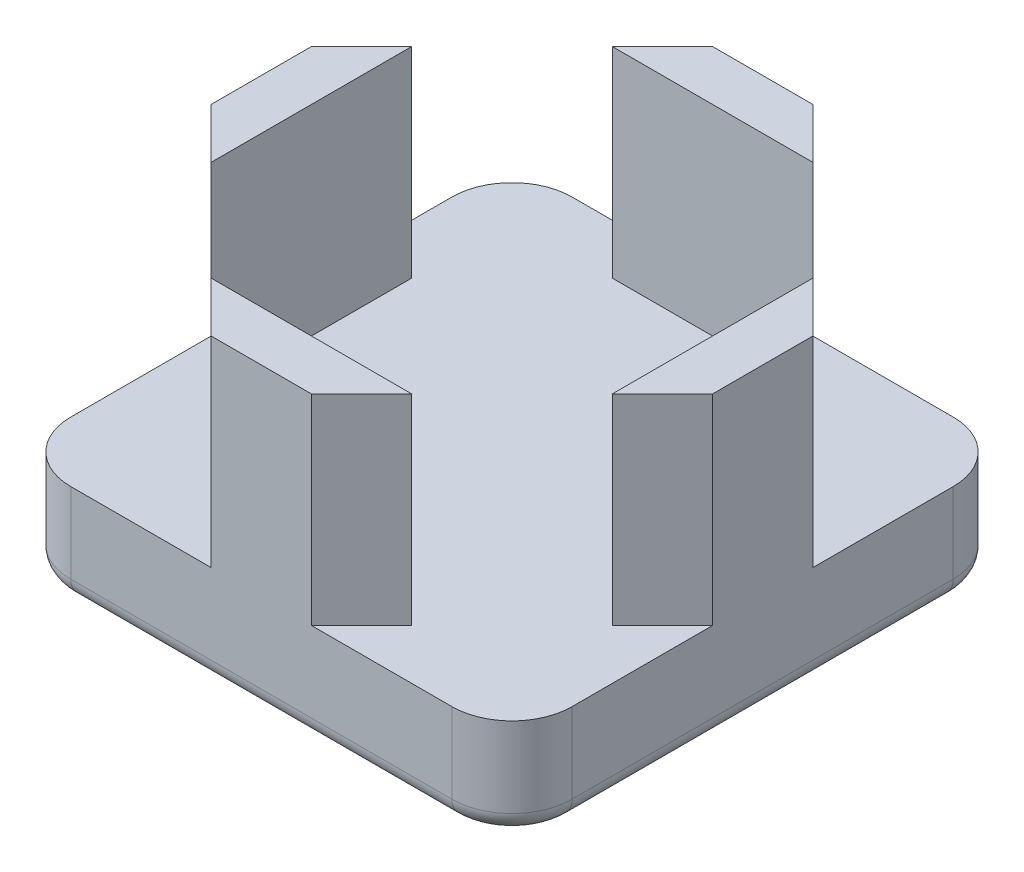
ISO-10303-21;
HEADER;
FILE_DESCRIPTION(('STEP AP214'),'2;1');
FILE_NAME('part.step','',(''),(''),'','','');
FILE_SCHEMA(('AUTOMOTIVE_DESIGN { 1 0 10303 214 1 1 1 1 }'));
ENDSEC;
DATA;
#1=APPLICATION_CONTEXT('core data for automotive mechanical design processes');
#2=APPLICATION_PROTOCOL_DEFINITION('international standard','automotive_design',2000,#1);
#3=PRODUCT_CONTEXT('',#1,'mechanical');
#4=PRODUCT('Part','Part','',(#3));
#5=PRODUCT_RELATED_PRODUCT_CATEGORY('part','',(#4));
#6=PRODUCT_DEFINITION_FORMATION('','',#4);
#7=PRODUCT_DEFINITION_CONTEXT('part definition',#1,'design');
#8=PRODUCT_DEFINITION('design','',#6,#7);
#9=PRODUCT_DEFINITION_SHAPE('','',#8);
#10=(LENGTH_UNIT() NAMED_UNIT(*) SI_UNIT(.MILLI.,.METRE.));
#11=(NAMED_UNIT(*) PLANE_ANGLE_UNIT() SI_UNIT($,.RADIAN.));
#12=(NAMED_UNIT(*) SI_UNIT($,.STERADIAN.) SOLID_ANGLE_UNIT());
#13=UNCERTAINTY_MEASURE_WITH_UNIT(LENGTH_MEASURE(1.E-05),#10,'distance_accuracy_value','');
#14=(GEOMETRIC_REPRESENTATION_CONTEXT(3) GLOBAL_UNCERTAINTY_ASSIGNED_CONTEXT((#13)) GLOBAL_UNIT_ASSIGNED_CONTEXT((#10,
#11,#12)) REPRESENTATION_CONTEXT('',''));
#15=CARTESIAN_POINT('',(0.,0.,0.));
#16=DIRECTION('',(0.,0.,1.));
#17=DIRECTION('',(1.,0.,0.));
#18=AXIS2_PLACEMENT_3D('',#15,#16,#17);
#19=CARTESIAN_POINT('',(0.,0.,0.));
#20=DIRECTION('',(0.,1.,0.));
#21=DIRECTION('',(0.,0.,1.));
#22=AXIS2_PLACEMENT_3D('',#19,#20,#21);
#23=PLANE('',#22);
#24=DIRECTION('',(-0.707106781186551,0.,0.707106781186545));
#25=VECTOR('',#24,1.);
#26=CARTESIAN_POINT('',(7.49999999999999,0.,7.50000000000005));
#27=LINE('',#26,#25);
#28=CARTESIAN_POINT('',(5.00000000000002,0.,10.));
#29=VERTEX_POINT('',#28);
#30=CARTESIAN_POINT('',(2.5,0.,12.5));
#31=VERTEX_POINT('',#30);
#32=EDGE_CURVE('E224',#29,#31,#27,.T.);
#33=ORIENTED_EDGE('',*,*,#32,.T.);
#34=DIRECTION('',(-1.,0.,0.));
#35=VECTOR('',#34,1.);
#36=CARTESIAN_POINT('',(0.,0.,12.5));
#37=LINE('',#36,#35);
#38=CARTESIAN_POINT('',(9.5,0.,12.5));
#39=VERTEX_POINT('',#38);
#40=EDGE_CURVE('E320',#39,#31,#37,.T.);
#41=ORIENTED_EDGE('',*,*,#40,.F.);
#42=CARTESIAN_POINT('',(9.5,0.,9.49999999999999));
#43=DIRECTION('',(0.,1.,0.));
#44=DIRECTION('',(0.,0.,1.));
#45=AXIS2_PLACEMENT_3D('',#42,#43,#44);
#46=CIRCLE('',#45,3.);
#47=CARTESIAN_POINT('',(12.5,0.,9.49999999999999));
#48=VERTEX_POINT('',#47);
#49=EDGE_CURVE('E323',#48,#39,#46,.F.);
#50=ORIENTED_EDGE('',*,*,#49,.F.);
#51=DIRECTION('',(0.,0.,1.));
#52=VECTOR('',#51,1.);
#53=CARTESIAN_POINT('',(12.5,0.,0.));
#54=LINE('',#53,#52);
#55=CARTESIAN_POINT('',(12.5,0.,2.5));
#56=VERTEX_POINT('',#55);
#57=EDGE_CURVE('E326',#56,#48,#54,.T.);
#58=ORIENTED_EDGE('',*,*,#57,.F.);
#59=DIRECTION('',(0.707106781186551,0.,-0.707106781186544));
#60=VECTOR('',#59,1.);
#61=CARTESIAN_POINT('',(7.49999999999994,0.,7.50000000000001));
#62=LINE('',#61,#60);
#63=CARTESIAN_POINT('',(10.,0.,4.99999999999998));
#64=VERTEX_POINT('',#63);
#65=EDGE_CURVE('E273',#64,#56,#62,.T.);
#66=ORIENTED_EDGE('',*,*,#65,.F.);
#67=DIRECTION('',(0.,0.,1.));
#68=VECTOR('',#67,1.);
#69=CARTESIAN_POINT('',(10.,0.,0.));
#70=LINE('',#69,#68);
#71=CARTESIAN_POINT('',(10.,0.,-5.00000000000005));
#72=VERTEX_POINT('',#71);
#73=EDGE_CURVE('E229',#72,#64,#70,.T.);
#74=ORIENTED_EDGE('',*,*,#73,.F.);
#75=DIRECTION('',(-0.707106781186537,0.,-0.707106781186558));
#76=VECTOR('',#75,1.);
#77=CARTESIAN_POINT('',(7.50000000000018,0.,-7.49999999999996));
#78=LINE('',#77,#76);
#79=CARTESIAN_POINT('',(12.5,0.,-2.5));
#80=VERTEX_POINT('',#79);
#81=EDGE_CURVE('E263',#80,#72,#78,.T.);
#82=ORIENTED_EDGE('',*,*,#81,.F.);
#83=CARTESIAN_POINT('',(12.5,0.,-9.5));
#84=VERTEX_POINT('',#83);
#85=EDGE_CURVE('E327',#84,#80,#54,.T.);
#86=ORIENTED_EDGE('',*,*,#85,.F.);
#87=CARTESIAN_POINT('',(9.5,0.,-9.5));
#88=DIRECTION('',(0.,1.,0.));
#89=DIRECTION('',(0.,0.,1.));
#90=AXIS2_PLACEMENT_3D('',#87,#88,#89);
#91=CIRCLE('',#90,3.);
#92=CARTESIAN_POINT('',(9.49999999999999,0.,-12.5));
#93=VERTEX_POINT('',#92);
#94=EDGE_CURVE('E330',#93,#84,#91,.F.);
#95=ORIENTED_EDGE('',*,*,#94,.F.);
#96=DIRECTION('',(1.,0.,0.));
#97=VECTOR('',#96,1.);
#98=CARTESIAN_POINT('',(0.,0.,-12.5));
#99=LINE('',#98,#97);
#100=CARTESIAN_POINT('',(2.5,0.,-12.5));
#101=VERTEX_POINT('',#100);
#102=EDGE_CURVE('E333',#101,#93,#99,.T.);
#103=ORIENTED_EDGE('',*,*,#102,.F.);
#104=DIRECTION('',(-0.707106781186545,0.,-0.70710678118655));
#105=VECTOR('',#104,1.);
#106=CARTESIAN_POINT('',(7.50000000000001,0.,-7.49999999999995));
#107=LINE('',#106,#105);
#108=CARTESIAN_POINT('',(4.99999999999998,0.,-10.));
#109=VERTEX_POINT('',#108);
#110=EDGE_CURVE('E300',#109,#101,#107,.T.);
#111=ORIENTED_EDGE('',*,*,#110,.F.);
#112=DIRECTION('',(1.,0.,0.));
#113=VECTOR('',#112,1.);
#114=CARTESIAN_POINT('',(0.,0.,-10.));
#115=LINE('',#114,#113);
#116=CARTESIAN_POINT('',(-5.00000000000002,0.,-10.));
#117=VERTEX_POINT('',#116);
#118=EDGE_CURVE('E285',#117,#109,#115,.T.);
#119=ORIENTED_EDGE('',*,*,#118,.F.);
#120=DIRECTION('',(-0.707106781186551,0.,0.707106781186544));
#121=VECTOR('',#120,1.);
#122=CARTESIAN_POINT('',(-7.49999999999999,0.,-7.50000000000007));
#123=LINE('',#122,#121);
#124=CARTESIAN_POINT('',(-2.5,0.,-12.5));
#125=VERTEX_POINT('',#124);
#126=EDGE_CURVE('E290',#125,#117,#123,.T.);
#127=ORIENTED_EDGE('',*,*,#126,.F.);
#128=CARTESIAN_POINT('',(-9.5,0.,-12.5));
#129=VERTEX_POINT('',#128);
#130=EDGE_CURVE('E334',#129,#125,#99,.T.);
#131=ORIENTED_EDGE('',*,*,#130,.F.);
#132=CARTESIAN_POINT('',(-9.5,0.,-9.5));
#133=DIRECTION('',(0.,1.,0.));
#134=DIRECTION('',(0.,0.,1.));
#135=AXIS2_PLACEMENT_3D('',#132,#133,#134);
#136=CIRCLE('',#135,3.);
#137=CARTESIAN_POINT('',(-12.5,0.,-9.5));
#138=VERTEX_POINT('',#137);
#139=EDGE_CURVE('E337',#129,#138,#136,.T.);
#140=ORIENTED_EDGE('',*,*,#139,.T.);
#141=DIRECTION('',(0.,0.,-1.));
#142=VECTOR('',#141,1.);
#143=CARTESIAN_POINT('',(-12.5,0.,0.));
#144=LINE('',#143,#142);
#145=CARTESIAN_POINT('',(-12.5,0.,-2.5));
#146=VERTEX_POINT('',#145);
#147=EDGE_CURVE('E312',#146,#138,#144,.T.);
#148=ORIENTED_EDGE('',*,*,#147,.F.);
#149=DIRECTION('',(-0.707106781186551,0.,0.707106781186544));
#150=VECTOR('',#149,1.);
#151=CARTESIAN_POINT('',(-7.49999999999994,0.,-7.50000000000001));
#152=LINE('',#151,#150);
#153=CARTESIAN_POINT('',(-10.,0.,-4.99999999999998));
#154=VERTEX_POINT('',#153);
#155=EDGE_CURVE('E371',#154,#146,#152,.T.);
#156=ORIENTED_EDGE('',*,*,#155,.F.);
#157=DIRECTION('',(0.,0.,-1.));
#158=VECTOR('',#157,1.);
#159=CARTESIAN_POINT('',(-10.,0.,0.));
#160=LINE('',#159,#158);
#161=CARTESIAN_POINT('',(-10.,0.,5.00000000000002));
#162=VERTEX_POINT('',#161);
#163=EDGE_CURVE('E343',#162,#154,#160,.T.);
#164=ORIENTED_EDGE('',*,*,#163,.F.);
#165=DIRECTION('',(0.707106781186545,0.,0.70710678118655));
#166=VECTOR('',#165,1.);
#167=CARTESIAN_POINT('',(-7.50000000000005,0.,7.49999999999999));
#168=LINE('',#167,#166);
#169=CARTESIAN_POINT('',(-12.5,0.,2.5));
#170=VERTEX_POINT('',#169);
#171=EDGE_CURVE('E361',#170,#162,#168,.T.);
#172=ORIENTED_EDGE('',*,*,#171,.F.);
#173=CARTESIAN_POINT('',(-12.5,0.,9.5));
#174=VERTEX_POINT('',#173);
#175=EDGE_CURVE('E313',#174,#170,#144,.T.);
#176=ORIENTED_EDGE('',*,*,#175,.F.);
#177=CARTESIAN_POINT('',(-9.5,0.,9.5));
#178=DIRECTION('',(0.,1.,0.));
#179=DIRECTION('',(0.,0.,1.));
#180=AXIS2_PLACEMENT_3D('',#177,#178,#179);
#181=CIRCLE('',#180,3.);
#182=CARTESIAN_POINT('',(-9.5,0.,12.5));
#183=VERTEX_POINT('',#182);
#184=EDGE_CURVE('E316',#183,#174,#181,.F.);
#185=ORIENTED_EDGE('',*,*,#184,.F.);
#186=CARTESIAN_POINT('',(-2.5,0.,12.5));
#187=VERTEX_POINT('',#186);
#188=EDGE_CURVE('E319',#187,#183,#37,.T.);
#189=ORIENTED_EDGE('',*,*,#188,.F.);
#190=DIRECTION('',(-0.707106781186544,0.,-0.707106781186551));
#191=VECTOR('',#190,1.);
#192=CARTESIAN_POINT('',(-7.50000000000001,0.,7.49999999999994));
#193=LINE('',#192,#191);
#194=CARTESIAN_POINT('',(-4.99999999999998,0.,10.));
#195=VERTEX_POINT('',#194);
#196=EDGE_CURVE('E240',#187,#195,#193,.T.);
#197=ORIENTED_EDGE('',*,*,#196,.T.);
#198=DIRECTION('',(1.,0.,0.));
#199=VECTOR('',#198,1.);
#200=CARTESIAN_POINT('',(0.,0.,10.));
#201=LINE('',#200,#199);
#202=EDGE_CURVE('E250',#195,#29,#201,.T.);
#203=ORIENTED_EDGE('',*,*,#202,.T.);
#204=EDGE_LOOP('',(#33,#41,#50,#58,#66,#74,#82,#86,#95,#103,#111,#119,#127,#131,#140,#148,#156,
#164,#172,#176,#185,#189,#197,#203));
#205=FACE_BOUND('',#204,.T.);
#206=ADVANCED_FACE('F32',(#205),#23,.T.);
#207=CARTESIAN_POINT('',(-10.,10.,0.));
#208=DIRECTION('',(-1.,0.,0.));
#209=DIRECTION('',(0.,0.,1.));
#210=AXIS2_PLACEMENT_3D('',#207,#208,#209);
#211=PLANE('',#210);
#212=ORIENTED_EDGE('',*,*,#163,.T.);
#213=DIRECTION('',(0.,-1.,0.));
#214=VECTOR('',#213,1.);
#215=CARTESIAN_POINT('',(-10.,10.,-4.99999999999998));
#216=LINE('',#215,#214);
#217=CARTESIAN_POINT('',(-10.,10.,-4.99999999999998));
#218=VERTEX_POINT('',#217);
#219=EDGE_CURVE('E384',#218,#154,#216,.T.);
#220=ORIENTED_EDGE('',*,*,#219,.F.);
#221=DIRECTION('',(0.,0.,-1.));
#222=VECTOR('',#221,1.);
#223=CARTESIAN_POINT('',(-10.,10.,0.));
#224=LINE('',#223,#222);
#225=CARTESIAN_POINT('',(-10.,10.,5.00000000000002));
#226=VERTEX_POINT('',#225);
#227=EDGE_CURVE('E357',#226,#218,#224,.T.);
#228=ORIENTED_EDGE('',*,*,#227,.F.);
#229=DIRECTION('',(0.,-1.,0.));
#230=VECTOR('',#229,1.);
#231=CARTESIAN_POINT('',(-10.,10.,5.00000000000002));
#232=LINE('',#231,#230);
#233=EDGE_CURVE('E368',#226,#162,#232,.T.);
#234=ORIENTED_EDGE('',*,*,#233,.T.);
#235=EDGE_LOOP('',(#212,#220,#228,#234));
#236=FACE_BOUND('',#235,.T.);
#237=ADVANCED_FACE('F515',(#236),#211,.F.);
#238=CARTESIAN_POINT('',(-7.49999999999994,10.,-7.50000000000001));
#239=DIRECTION('',(0.707106781186544,0.,0.707106781186551));
#240=DIRECTION('',(0.707106781186551,0.,-0.707106781186544));
#241=AXIS2_PLACEMENT_3D('',#238,#239,#240);
#242=PLANE('',#241);
#243=ORIENTED_EDGE('',*,*,#155,.T.);
#244=DIRECTION('',(0.,-1.,0.));
#245=VECTOR('',#244,1.);
#246=CARTESIAN_POINT('',(-12.5,10.,-2.5));
#247=LINE('',#246,#245);
#248=CARTESIAN_POINT('',(-12.5,10.,-2.5));
#249=VERTEX_POINT('',#248);
#250=EDGE_CURVE('E381',#249,#146,#247,.T.);
#251=ORIENTED_EDGE('',*,*,#250,.F.);
#252=DIRECTION('',(-0.707106781186551,0.,0.707106781186544));
#253=VECTOR('',#252,1.);
#254=CARTESIAN_POINT('',(-7.49999999999994,10.,-7.50000000000001));
#255=LINE('',#254,#253);
#256=EDGE_CURVE('E360',#218,#249,#255,.T.);
#257=ORIENTED_EDGE('',*,*,#256,.F.);
#258=ORIENTED_EDGE('',*,*,#219,.T.);
#259=EDGE_LOOP('',(#243,#251,#257,#258));
#260=FACE_BOUND('',#259,.T.);
#261=ADVANCED_FACE('F520',(#260),#242,.F.);
#262=CARTESIAN_POINT('',(-12.5,10.,0.));
#263=DIRECTION('',(-1.,0.,0.));
#264=DIRECTION('',(0.,0.,1.));
#265=AXIS2_PLACEMENT_3D('',#262,#263,#264);
#266=PLANE('',#265);
#267=DIRECTION('',(0.,1.,0.));
#268=VECTOR('',#267,1.);
#269=CARTESIAN_POINT('',(-12.5,-5.,-9.5));
#270=LINE('',#269,#268);
#271=CARTESIAN_POINT('',(-12.5,-4.,-9.5));
#272=VERTEX_POINT('',#271);
#273=EDGE_CURVE('E341',#272,#138,#270,.T.);
#274=ORIENTED_EDGE('',*,*,#273,.F.);
#275=DIRECTION('',(0.,0.,-1.));
#276=VECTOR('',#275,1.);
#277=CARTESIAN_POINT('',(-12.5,-4.,9.5));
#278=LINE('',#277,#276);
#279=CARTESIAN_POINT('',(-12.5,-4.,9.5));
#280=VERTEX_POINT('',#279);
#281=EDGE_CURVE('E11',#272,#280,#278,.F.);
#282=ORIENTED_EDGE('',*,*,#281,.T.);
#283=DIRECTION('',(0.,1.,0.));
#284=VECTOR('',#283,1.);
#285=CARTESIAN_POINT('',(-12.5,-5.,9.5));
#286=LINE('',#285,#284);
#287=EDGE_CURVE('E340',#280,#174,#286,.T.);
#288=ORIENTED_EDGE('',*,*,#287,.T.);
#289=ORIENTED_EDGE('',*,*,#175,.T.);
#290=DIRECTION('',(0.,-1.,0.));
#291=VECTOR('',#290,1.);
#292=CARTESIAN_POINT('',(-12.5,10.,2.5));
#293=LINE('',#292,#291);
#294=CARTESIAN_POINT('',(-12.5,10.,2.5));
#295=VERTEX_POINT('',#294);
#296=EDGE_CURVE('E378',#295,#170,#293,.T.);
#297=ORIENTED_EDGE('',*,*,#296,.F.);
#298=DIRECTION('',(0.,0.,-1.));
#299=VECTOR('',#298,1.);
#300=CARTESIAN_POINT('',(-12.5,10.,0.));
#301=LINE('',#300,#299);
#302=EDGE_CURVE('E363',#295,#249,#301,.T.);
#303=ORIENTED_EDGE('',*,*,#302,.T.);
#304=ORIENTED_EDGE('',*,*,#250,.T.);
#305=ORIENTED_EDGE('',*,*,#147,.T.);
#306=EDGE_LOOP('',(#274,#282,#288,#289,#297,#303,#304,#305));
#307=FACE_BOUND('',#306,.T.);
#308=ADVANCED_FACE('F497',(#307),#266,.T.);
#309=CARTESIAN_POINT('',(-7.50000000000005,10.,7.49999999999999));
#310=DIRECTION('',(0.70710678118655,0.,-0.707106781186545));
#311=DIRECTION('',(-0.707106781186545,0.,-0.70710678118655));
#312=AXIS2_PLACEMENT_3D('',#309,#310,#311);
#313=PLANE('',#312);
#314=ORIENTED_EDGE('',*,*,#171,.T.);
#315=ORIENTED_EDGE('',*,*,#233,.F.);
#316=DIRECTION('',(0.707106781186545,0.,0.70710678118655));
#317=VECTOR('',#316,1.);
#318=CARTESIAN_POINT('',(-7.50000000000005,10.,7.49999999999999));
#319=LINE('',#318,#317);
#320=EDGE_CURVE('E366',#295,#226,#319,.T.);
#321=ORIENTED_EDGE('',*,*,#320,.F.);
#322=ORIENTED_EDGE('',*,*,#296,.T.);
#323=EDGE_LOOP('',(#314,#315,#321,#322));
#324=FACE_BOUND('',#323,.T.);
#325=ADVANCED_FACE('F545',(#324),#313,.F.);
#326=CARTESIAN_POINT('',(0.,10.,0.));
#327=DIRECTION('',(0.,1.,0.));
#328=DIRECTION('',(0.,0.,1.));
#329=AXIS2_PLACEMENT_3D('',#326,#327,#328);
#330=PLANE('',#329);
#331=ORIENTED_EDGE('',*,*,#227,.T.);
#332=ORIENTED_EDGE('',*,*,#256,.T.);
#333=ORIENTED_EDGE('',*,*,#302,.F.);
#334=ORIENTED_EDGE('',*,*,#320,.T.);
#335=EDGE_LOOP('',(#331,#332,#333,#334));
#336=FACE_BOUND('',#335,.T.);
#337=ADVANCED_FACE('F528',(#336),#330,.T.);
#338=CARTESIAN_POINT('',(-9.5,-5.,-9.5));
#339=DIRECTION('',(0.,1.,0.));
#340=DIRECTION('',(0.,0.,1.));
#341=AXIS2_PLACEMENT_3D('',#338,#339,#340);
#342=CYLINDRICAL_SURFACE('',#341,3.);
#343=DIRECTION('',(0.,1.,0.));
#344=VECTOR('',#343,1.);
#345=CARTESIAN_POINT('',(-9.5,-5.,-12.5));
#346=LINE('',#345,#344);
#347=CARTESIAN_POINT('',(-9.5,-4.,-12.5));
#348=VERTEX_POINT('',#347);
#349=EDGE_CURVE('E344',#348,#129,#346,.T.);
#350=ORIENTED_EDGE('',*,*,#349,.F.);
#351=CARTESIAN_POINT('',(-9.5,-4.,-9.5));
#352=DIRECTION('',(0.,1.,0.));
#353=DIRECTION('',(0.,0.,1.));
#354=AXIS2_PLACEMENT_3D('',#351,#352,#353);
#355=CIRCLE('',#354,3.);
#356=EDGE_CURVE('E41',#348,#272,#355,.T.);
#357=ORIENTED_EDGE('',*,*,#356,.T.);
#358=ORIENTED_EDGE('',*,*,#273,.T.);
#359=ORIENTED_EDGE('',*,*,#139,.F.);
#360=EDGE_LOOP('',(#350,#357,#358,#359));
#361=FACE_BOUND('',#360,.T.);
#362=ADVANCED_FACE('F525',(#361),#342,.T.);
#363=CARTESIAN_POINT('',(0.,-5.,-12.5));
#364=DIRECTION('',(0.,0.,1.));
#365=DIRECTION('',(1.,0.,0.));
#366=AXIS2_PLACEMENT_3D('',#363,#364,#365);
#367=PLANE('',#366);
#368=DIRECTION('',(0.,1.,0.));
#369=VECTOR('',#368,1.);
#370=CARTESIAN_POINT('',(9.49999999999999,-5.,-12.5));
#371=LINE('',#370,#369);
#372=CARTESIAN_POINT('',(9.49999999999999,-4.,-12.5));
#373=VERTEX_POINT('',#372);
#374=EDGE_CURVE('E346',#373,#93,#371,.T.);
#375=ORIENTED_EDGE('',*,*,#374,.F.);
#376=DIRECTION('',(1.,0.,0.));
#377=VECTOR('',#376,1.);
#378=CARTESIAN_POINT('',(0.,-4.,-12.5));
#379=LINE('',#378,#377);
#380=EDGE_CURVE('E56',#373,#348,#379,.F.);
#381=ORIENTED_EDGE('',*,*,#380,.T.);
#382=ORIENTED_EDGE('',*,*,#349,.T.);
#383=ORIENTED_EDGE('',*,*,#130,.T.);
#384=DIRECTION('',(0.,-1.,0.));
#385=VECTOR('',#384,1.);
#386=CARTESIAN_POINT('',(-2.5,10.,-12.5));
#387=LINE('',#386,#385);
#388=CARTESIAN_POINT('',(-2.5,10.,-12.5));
#389=VERTEX_POINT('',#388);
#390=EDGE_CURVE('E305',#389,#125,#387,.T.);
#391=ORIENTED_EDGE('',*,*,#390,.F.);
#392=DIRECTION('',(1.,0.,0.));
#393=VECTOR('',#392,1.);
#394=CARTESIAN_POINT('',(0.,10.,-12.5));
#395=LINE('',#394,#393);
#396=CARTESIAN_POINT('',(2.5,10.,-12.5));
#397=VERTEX_POINT('',#396);
#398=EDGE_CURVE('E292',#389,#397,#395,.T.);
#399=ORIENTED_EDGE('',*,*,#398,.T.);
#400=DIRECTION('',(0.,-1.,0.));
#401=VECTOR('',#400,1.);
#402=CARTESIAN_POINT('',(2.5,10.,-12.5));
#403=LINE('',#402,#401);
#404=EDGE_CURVE('E307',#397,#101,#403,.T.);
#405=ORIENTED_EDGE('',*,*,#404,.T.);
#406=ORIENTED_EDGE('',*,*,#102,.T.);
#407=EDGE_LOOP('',(#375,#381,#382,#383,#391,#399,#405,#406));
#408=FACE_BOUND('',#407,.T.);
#409=ADVANCED_FACE('F451',(#408),#367,.F.);
#410=CARTESIAN_POINT('',(9.5,-5.,-9.5));
#411=DIRECTION('',(0.,1.,0.));
#412=DIRECTION('',(0.,0.,1.));
#413=AXIS2_PLACEMENT_3D('',#410,#411,#412);
#414=CYLINDRICAL_SURFACE('',#413,3.);
#415=DIRECTION('',(0.,1.,0.));
#416=VECTOR('',#415,1.);
#417=CARTESIAN_POINT('',(12.5,-5.,-9.5));
#418=LINE('',#417,#416);
#419=CARTESIAN_POINT('',(12.5,-4.,-9.5));
#420=VERTEX_POINT('',#419);
#421=EDGE_CURVE('E348',#420,#84,#418,.T.);
#422=ORIENTED_EDGE('',*,*,#421,.F.);
#423=CARTESIAN_POINT('',(9.5,-4.,-9.5));
#424=DIRECTION('',(0.,1.,0.));
#425=DIRECTION('',(0.,0.,1.));
#426=AXIS2_PLACEMENT_3D('',#423,#424,#425);
#427=CIRCLE('',#426,3.);
#428=EDGE_CURVE('E413',#420,#373,#427,.T.);
#429=ORIENTED_EDGE('',*,*,#428,.T.);
#430=ORIENTED_EDGE('',*,*,#374,.T.);
#431=ORIENTED_EDGE('',*,*,#94,.T.);
#432=EDGE_LOOP('',(#422,#429,#430,#431));
#433=FACE_BOUND('',#432,.T.);
#434=ADVANCED_FACE('F449',(#433),#414,.T.);
#435=CARTESIAN_POINT('',(12.5,-5.,0.));
#436=DIRECTION('',(-1.,0.,0.));
#437=DIRECTION('',(0.,0.,1.));
#438=AXIS2_PLACEMENT_3D('',#435,#436,#437);
#439=PLANE('',#438);
#440=DIRECTION('',(0.,1.,0.));
#441=VECTOR('',#440,1.);
#442=CARTESIAN_POINT('',(12.5,-5.,9.49999999999999));
#443=LINE('',#442,#441);
#444=CARTESIAN_POINT('',(12.5,-4.,9.49999999999999));
#445=VERTEX_POINT('',#444);
#446=EDGE_CURVE('E350',#445,#48,#443,.T.);
#447=ORIENTED_EDGE('',*,*,#446,.F.);
#448=DIRECTION('',(0.,0.,1.));
#449=VECTOR('',#448,1.);
#450=CARTESIAN_POINT('',(12.5,-4.,0.));
#451=LINE('',#450,#449);
#452=EDGE_CURVE('E411',#445,#420,#451,.F.);
#453=ORIENTED_EDGE('',*,*,#452,.T.);
#454=ORIENTED_EDGE('',*,*,#421,.T.);
#455=ORIENTED_EDGE('',*,*,#85,.T.);
#456=DIRECTION('',(0.,-1.,0.));
#457=VECTOR('',#456,1.);
#458=CARTESIAN_POINT('',(12.5,10.,-2.5));
#459=LINE('',#458,#457);
#460=CARTESIAN_POINT('',(12.5,10.,-2.5));
#461=VERTEX_POINT('',#460);
#462=EDGE_CURVE('E278',#461,#80,#459,.T.);
#463=ORIENTED_EDGE('',*,*,#462,.F.);
#464=DIRECTION('',(0.,0.,1.));
#465=VECTOR('',#464,1.);
#466=CARTESIAN_POINT('',(12.5,10.,0.));
#467=LINE('',#466,#465);
#468=CARTESIAN_POINT('',(12.5,10.,2.5));
#469=VERTEX_POINT('',#468);
#470=EDGE_CURVE('E265',#461,#469,#467,.T.);
#471=ORIENTED_EDGE('',*,*,#470,.T.);
#472=DIRECTION('',(0.,-1.,0.));
#473=VECTOR('',#472,1.);
#474=CARTESIAN_POINT('',(12.5,10.,2.5));
#475=LINE('',#474,#473);
#476=EDGE_CURVE('E280',#469,#56,#475,.T.);
#477=ORIENTED_EDGE('',*,*,#476,.T.);
#478=ORIENTED_EDGE('',*,*,#57,.T.);
#479=EDGE_LOOP('',(#447,#453,#454,#455,#463,#471,#477,#478));
#480=FACE_BOUND('',#479,.T.);
#481=ADVANCED_FACE('F462',(#480),#439,.F.);
#482=CARTESIAN_POINT('',(9.5,-5.,9.49999999999999));
#483=DIRECTION('',(0.,1.,0.));
#484=DIRECTION('',(0.,0.,1.));
#485=AXIS2_PLACEMENT_3D('',#482,#483,#484);
#486=CYLINDRICAL_SURFACE('',#485,3.);
#487=DIRECTION('',(0.,1.,0.));
#488=VECTOR('',#487,1.);
#489=CARTESIAN_POINT('',(9.5,-5.,12.5));
#490=LINE('',#489,#488);
#491=CARTESIAN_POINT('',(9.5,-4.,12.5));
#492=VERTEX_POINT('',#491);
#493=EDGE_CURVE('E352',#492,#39,#490,.T.);
#494=ORIENTED_EDGE('',*,*,#493,.F.);
#495=CARTESIAN_POINT('',(9.5,-4.,9.49999999999999));
#496=DIRECTION('',(0.,1.,0.));
#497=DIRECTION('',(0.,0.,1.));
#498=AXIS2_PLACEMENT_3D('',#495,#496,#497);
#499=CIRCLE('',#498,3.);
#500=EDGE_CURVE('E409',#492,#445,#499,.T.);
#501=ORIENTED_EDGE('',*,*,#500,.T.);
#502=ORIENTED_EDGE('',*,*,#446,.T.);
#503=ORIENTED_EDGE('',*,*,#49,.T.);
#504=EDGE_LOOP('',(#494,#501,#502,#503));
#505=FACE_BOUND('',#504,.T.);
#506=ADVANCED_FACE('F469',(#505),#486,.T.);
#507=CARTESIAN_POINT('',(0.,-5.,12.5));
#508=DIRECTION('',(0.,0.,-1.));
#509=DIRECTION('',(-1.,0.,0.));
#510=AXIS2_PLACEMENT_3D('',#507,#508,#509);
#511=PLANE('',#510);
#512=DIRECTION('',(0.,1.,0.));
#513=VECTOR('',#512,1.);
#514=CARTESIAN_POINT('',(-9.5,-5.,12.5));
#515=LINE('',#514,#513);
#516=CARTESIAN_POINT('',(-9.5,-4.,12.5));
#517=VERTEX_POINT('',#516);
#518=EDGE_CURVE('E354',#517,#183,#515,.T.);
#519=ORIENTED_EDGE('',*,*,#518,.F.);
#520=DIRECTION('',(-1.,0.,0.));
#521=VECTOR('',#520,1.);
#522=CARTESIAN_POINT('',(0.,-4.,12.5));
#523=LINE('',#522,#521);
#524=EDGE_CURVE('E407',#517,#492,#523,.F.);
#525=ORIENTED_EDGE('',*,*,#524,.T.);
#526=ORIENTED_EDGE('',*,*,#493,.T.);
#527=ORIENTED_EDGE('',*,*,#40,.T.);
#528=DIRECTION('',(0.,-1.,0.));
#529=VECTOR('',#528,1.);
#530=CARTESIAN_POINT('',(2.5,10.,12.5));
#531=LINE('',#530,#529);
#532=CARTESIAN_POINT('',(2.5,10.,12.5));
#533=VERTEX_POINT('',#532);
#534=EDGE_CURVE('E248',#533,#31,#531,.T.);
#535=ORIENTED_EDGE('',*,*,#534,.F.);
#536=DIRECTION('',(-1.,0.,0.));
#537=VECTOR('',#536,1.);
#538=CARTESIAN_POINT('',(0.,10.,12.5));
#539=LINE('',#538,#537);
#540=CARTESIAN_POINT('',(-2.5,10.,12.5));
#541=VERTEX_POINT('',#540);
#542=EDGE_CURVE('E239',#533,#541,#539,.T.);
#543=ORIENTED_EDGE('',*,*,#542,.T.);
#544=DIRECTION('',(0.,-1.,0.));
#545=VECTOR('',#544,1.);
#546=CARTESIAN_POINT('',(-2.5,10.,12.5));
#547=LINE('',#546,#545);
#548=EDGE_CURVE('E255',#541,#187,#547,.T.);
#549=ORIENTED_EDGE('',*,*,#548,.T.);
#550=ORIENTED_EDGE('',*,*,#188,.T.);
#551=EDGE_LOOP('',(#519,#525,#526,#527,#535,#543,#549,#550));
#552=FACE_BOUND('',#551,.T.);
#553=ADVANCED_FACE('F537',(#552),#511,.F.);
#554=CARTESIAN_POINT('',(-9.5,-5.,9.5));
#555=DIRECTION('',(0.,1.,0.));
#556=DIRECTION('',(0.,0.,1.));
#557=AXIS2_PLACEMENT_3D('',#554,#555,#556);
#558=CYLINDRICAL_SURFACE('',#557,3.);
#559=ORIENTED_EDGE('',*,*,#287,.F.);
#560=CARTESIAN_POINT('',(-9.5,-4.,9.5));
#561=DIRECTION('',(0.,1.,0.));
#562=DIRECTION('',(0.,0.,1.));
#563=AXIS2_PLACEMENT_3D('',#560,#561,#562);
#564=CIRCLE('',#563,3.);
#565=EDGE_CURVE('E404',#280,#517,#564,.T.);
#566=ORIENTED_EDGE('',*,*,#565,.T.);
#567=ORIENTED_EDGE('',*,*,#518,.T.);
#568=ORIENTED_EDGE('',*,*,#184,.T.);
#569=EDGE_LOOP('',(#559,#566,#567,#568));
#570=FACE_BOUND('',#569,.T.);
#571=ADVANCED_FACE('F501',(#570),#558,.T.);
#572=CARTESIAN_POINT('',(0.,-5.,0.));
#573=DIRECTION('',(0.,1.,0.));
#574=DIRECTION('',(0.,0.,1.));
#575=AXIS2_PLACEMENT_3D('',#572,#573,#574);
#576=PLANE('',#575);
#577=DIRECTION('',(-1.,0.,0.));
#578=VECTOR('',#577,1.);
#579=CARTESIAN_POINT('',(0.,-5.,11.5));
#580=LINE('',#579,#578);
#581=CARTESIAN_POINT('',(9.5,-5.,11.5));
#582=VERTEX_POINT('',#581);
#583=CARTESIAN_POINT('',(-9.5,-5.,11.5));
#584=VERTEX_POINT('',#583);
#585=EDGE_CURVE('E399',#582,#584,#580,.T.);
#586=ORIENTED_EDGE('',*,*,#585,.T.);
#587=CARTESIAN_POINT('',(-9.5,-5.,9.5));
#588=DIRECTION('',(0.,1.,0.));
#589=DIRECTION('',(0.,0.,1.));
#590=AXIS2_PLACEMENT_3D('',#587,#588,#589);
#591=CIRCLE('',#590,2.);
#592=CARTESIAN_POINT('',(-11.5,-5.,9.5));
#593=VERTEX_POINT('',#592);
#594=EDGE_CURVE('E401',#584,#593,#591,.F.);
#595=ORIENTED_EDGE('',*,*,#594,.T.);
#596=DIRECTION('',(0.,0.,-1.));
#597=VECTOR('',#596,1.);
#598=CARTESIAN_POINT('',(-11.5,-5.,-9.5));
#599=LINE('',#598,#597);
#600=CARTESIAN_POINT('',(-11.5,-5.,-9.5));
#601=VERTEX_POINT('',#600);
#602=EDGE_CURVE('E387',#593,#601,#599,.T.);
#603=ORIENTED_EDGE('',*,*,#602,.T.);
#604=CARTESIAN_POINT('',(-9.5,-5.,-9.5));
#605=DIRECTION('',(0.,1.,0.));
#606=DIRECTION('',(0.,0.,1.));
#607=AXIS2_PLACEMENT_3D('',#604,#605,#606);
#608=CIRCLE('',#607,2.);
#609=CARTESIAN_POINT('',(-9.5,-5.,-11.5));
#610=VERTEX_POINT('',#609);
#611=EDGE_CURVE('E389',#601,#610,#608,.F.);
#612=ORIENTED_EDGE('',*,*,#611,.T.);
#613=DIRECTION('',(1.,0.,0.));
#614=VECTOR('',#613,1.);
#615=CARTESIAN_POINT('',(0.,-5.,-11.5));
#616=LINE('',#615,#614);
#617=CARTESIAN_POINT('',(9.5,-5.,-11.5));
#618=VERTEX_POINT('',#617);
#619=EDGE_CURVE('E391',#610,#618,#616,.T.);
#620=ORIENTED_EDGE('',*,*,#619,.T.);
#621=CARTESIAN_POINT('',(9.5,-5.,-9.5));
#622=DIRECTION('',(0.,1.,0.));
#623=DIRECTION('',(0.,0.,1.));
#624=AXIS2_PLACEMENT_3D('',#621,#622,#623);
#625=CIRCLE('',#624,2.);
#626=CARTESIAN_POINT('',(11.5,-5.,-9.5));
#627=VERTEX_POINT('',#626);
#628=EDGE_CURVE('E393',#618,#627,#625,.F.);
#629=ORIENTED_EDGE('',*,*,#628,.T.);
#630=DIRECTION('',(0.,0.,1.));
#631=VECTOR('',#630,1.);
#632=CARTESIAN_POINT('',(11.5,-5.,0.));
#633=LINE('',#632,#631);
#634=CARTESIAN_POINT('',(11.5,-5.,9.49999999999999));
#635=VERTEX_POINT('',#634);
#636=EDGE_CURVE('E395',#627,#635,#633,.T.);
#637=ORIENTED_EDGE('',*,*,#636,.T.);
#638=CARTESIAN_POINT('',(9.5,-5.,9.49999999999999));
#639=DIRECTION('',(0.,1.,0.));
#640=DIRECTION('',(0.,0.,1.));
#641=AXIS2_PLACEMENT_3D('',#638,#639,#640);
#642=CIRCLE('',#641,2.);
#643=EDGE_CURVE('E397',#635,#582,#642,.F.);
#644=ORIENTED_EDGE('',*,*,#643,.T.);
#645=EDGE_LOOP('',(#586,#595,#603,#612,#620,#629,#637,#644));
#646=FACE_BOUND('',#645,.T.);
#647=ADVANCED_FACE('F483',(#646),#576,.F.);
#648=CARTESIAN_POINT('',(0.,10.,-10.));
#649=DIRECTION('',(0.,0.,-1.));
#650=DIRECTION('',(-1.,0.,0.));
#651=AXIS2_PLACEMENT_3D('',#648,#649,#650);
#652=PLANE('',#651);
#653=ORIENTED_EDGE('',*,*,#118,.T.);
#654=DIRECTION('',(0.,-1.,0.));
#655=VECTOR('',#654,1.);
#656=CARTESIAN_POINT('',(4.99999999999998,10.,-10.));
#657=LINE('',#656,#655);
#658=CARTESIAN_POINT('',(4.99999999999998,10.,-10.));
#659=VERTEX_POINT('',#658);
#660=EDGE_CURVE('E310',#659,#109,#657,.T.);
#661=ORIENTED_EDGE('',*,*,#660,.F.);
#662=DIRECTION('',(1.,0.,0.));
#663=VECTOR('',#662,1.);
#664=CARTESIAN_POINT('',(0.,10.,-10.));
#665=LINE('',#664,#663);
#666=CARTESIAN_POINT('',(-5.00000000000002,10.,-10.));
#667=VERTEX_POINT('',#666);
#668=EDGE_CURVE('E286',#667,#659,#665,.T.);
#669=ORIENTED_EDGE('',*,*,#668,.F.);
#670=DIRECTION('',(0.,-1.,0.));
#671=VECTOR('',#670,1.);
#672=CARTESIAN_POINT('',(-5.00000000000002,10.,-10.));
#673=LINE('',#672,#671);
#674=EDGE_CURVE('E297',#667,#117,#673,.T.);
#675=ORIENTED_EDGE('',*,*,#674,.T.);
#676=EDGE_LOOP('',(#653,#661,#669,#675));
#677=FACE_BOUND('',#676,.T.);
#678=ADVANCED_FACE('F604',(#677),#652,.F.);
#679=CARTESIAN_POINT('',(7.50000000000001,10.,-7.49999999999995));
#680=DIRECTION('',(-0.70710678118655,0.,0.707106781186545));
#681=DIRECTION('',(0.707106781186545,0.,0.70710678118655));
#682=AXIS2_PLACEMENT_3D('',#679,#680,#681);
#683=PLANE('',#682);
#684=ORIENTED_EDGE('',*,*,#110,.T.);
#685=ORIENTED_EDGE('',*,*,#404,.F.);
#686=DIRECTION('',(-0.707106781186545,0.,-0.70710678118655));
#687=VECTOR('',#686,1.);
#688=CARTESIAN_POINT('',(7.50000000000001,10.,-7.49999999999995));
#689=LINE('',#688,#687);
#690=EDGE_CURVE('E289',#659,#397,#689,.T.);
#691=ORIENTED_EDGE('',*,*,#690,.F.);
#692=ORIENTED_EDGE('',*,*,#660,.T.);
#693=EDGE_LOOP('',(#684,#685,#691,#692));
#694=FACE_BOUND('',#693,.T.);
#695=ADVANCED_FACE('F601',(#694),#683,.F.);
#696=CARTESIAN_POINT('',(-7.49999999999999,10.,-7.50000000000007));
#697=DIRECTION('',(0.707106781186544,0.,0.707106781186551));
#698=DIRECTION('',(0.707106781186551,0.,-0.707106781186544));
#699=AXIS2_PLACEMENT_3D('',#696,#697,#698);
#700=PLANE('',#699);
#701=ORIENTED_EDGE('',*,*,#126,.T.);
#702=ORIENTED_EDGE('',*,*,#674,.F.);
#703=DIRECTION('',(-0.707106781186551,0.,0.707106781186544));
#704=VECTOR('',#703,1.);
#705=CARTESIAN_POINT('',(-7.49999999999999,10.,-7.50000000000007));
#706=LINE('',#705,#704);
#707=EDGE_CURVE('E295',#389,#667,#706,.T.);
#708=ORIENTED_EDGE('',*,*,#707,.F.);
#709=ORIENTED_EDGE('',*,*,#390,.T.);
#710=EDGE_LOOP('',(#701,#702,#708,#709));
#711=FACE_BOUND('',#710,.T.);
#712=ADVANCED_FACE('F597',(#711),#700,.F.);
#713=CARTESIAN_POINT('',(0.,10.,0.));
#714=DIRECTION('',(0.,1.,0.));
#715=DIRECTION('',(0.,0.,1.));
#716=AXIS2_PLACEMENT_3D('',#713,#714,#715);
#717=PLANE('',#716);
#718=ORIENTED_EDGE('',*,*,#668,.T.);
#719=ORIENTED_EDGE('',*,*,#690,.T.);
#720=ORIENTED_EDGE('',*,*,#398,.F.);
#721=ORIENTED_EDGE('',*,*,#707,.T.);
#722=EDGE_LOOP('',(#718,#719,#720,#721));
#723=FACE_BOUND('',#722,.T.);
#724=ADVANCED_FACE('F594',(#723),#717,.T.);
#725=CARTESIAN_POINT('',(10.,10.,0.));
#726=DIRECTION('',(1.,0.,0.));
#727=DIRECTION('',(0.,0.,-1.));
#728=AXIS2_PLACEMENT_3D('',#725,#726,#727);
#729=PLANE('',#728);
#730=ORIENTED_EDGE('',*,*,#73,.T.);
#731=DIRECTION('',(0.,-1.,0.));
#732=VECTOR('',#731,1.);
#733=CARTESIAN_POINT('',(10.,10.,4.99999999999998));
#734=LINE('',#733,#732);
#735=CARTESIAN_POINT('',(10.,10.,4.99999999999998));
#736=VERTEX_POINT('',#735);
#737=EDGE_CURVE('E283',#736,#64,#734,.T.);
#738=ORIENTED_EDGE('',*,*,#737,.F.);
#739=DIRECTION('',(0.,0.,1.));
#740=VECTOR('',#739,1.);
#741=CARTESIAN_POINT('',(10.,10.,0.));
#742=LINE('',#741,#740);
#743=CARTESIAN_POINT('',(10.,10.,-5.00000000000005));
#744=VERTEX_POINT('',#743);
#745=EDGE_CURVE('E259',#744,#736,#742,.T.);
#746=ORIENTED_EDGE('',*,*,#745,.F.);
#747=DIRECTION('',(0.,-1.,0.));
#748=VECTOR('',#747,1.);
#749=CARTESIAN_POINT('',(10.,10.,-5.00000000000005));
#750=LINE('',#749,#748);
#751=EDGE_CURVE('E270',#744,#72,#750,.T.);
#752=ORIENTED_EDGE('',*,*,#751,.T.);
#753=EDGE_LOOP('',(#730,#738,#746,#752));
#754=FACE_BOUND('',#753,.T.);
#755=ADVANCED_FACE('F579',(#754),#729,.F.);
#756=CARTESIAN_POINT('',(7.49999999999994,10.,7.50000000000001));
#757=DIRECTION('',(-0.707106781186544,0.,-0.707106781186551));
#758=DIRECTION('',(-0.707106781186551,0.,0.707106781186544));
#759=AXIS2_PLACEMENT_3D('',#756,#757,#758);
#760=PLANE('',#759);
#761=ORIENTED_EDGE('',*,*,#65,.T.);
#762=ORIENTED_EDGE('',*,*,#476,.F.);
#763=DIRECTION('',(0.707106781186551,0.,-0.707106781186544));
#764=VECTOR('',#763,1.);
#765=CARTESIAN_POINT('',(7.49999999999994,10.,7.50000000000001));
#766=LINE('',#765,#764);
#767=EDGE_CURVE('E262',#736,#469,#766,.T.);
#768=ORIENTED_EDGE('',*,*,#767,.F.);
#769=ORIENTED_EDGE('',*,*,#737,.T.);
#770=EDGE_LOOP('',(#761,#762,#768,#769));
#771=FACE_BOUND('',#770,.T.);
#772=ADVANCED_FACE('F571',(#771),#760,.F.);
#773=CARTESIAN_POINT('',(7.50000000000018,10.,-7.49999999999996));
#774=DIRECTION('',(-0.707106781186558,0.,0.707106781186537));
#775=DIRECTION('',(0.707106781186537,0.,0.707106781186558));
#776=AXIS2_PLACEMENT_3D('',#773,#774,#775);
#777=PLANE('',#776);
#778=ORIENTED_EDGE('',*,*,#81,.T.);
#779=ORIENTED_EDGE('',*,*,#751,.F.);
#780=DIRECTION('',(-0.707106781186537,0.,-0.707106781186558));
#781=VECTOR('',#780,1.);
#782=CARTESIAN_POINT('',(7.50000000000018,10.,-7.49999999999996));
#783=LINE('',#782,#781);
#784=EDGE_CURVE('E268',#461,#744,#783,.T.);
#785=ORIENTED_EDGE('',*,*,#784,.F.);
#786=ORIENTED_EDGE('',*,*,#462,.T.);
#787=EDGE_LOOP('',(#778,#779,#785,#786));
#788=FACE_BOUND('',#787,.T.);
#789=ADVANCED_FACE('F581',(#788),#777,.F.);
#790=CARTESIAN_POINT('',(0.,10.,0.));
#791=DIRECTION('',(0.,1.,0.));
#792=DIRECTION('',(0.,0.,1.));
#793=AXIS2_PLACEMENT_3D('',#790,#791,#792);
#794=PLANE('',#793);
#795=ORIENTED_EDGE('',*,*,#745,.T.);
#796=ORIENTED_EDGE('',*,*,#767,.T.);
#797=ORIENTED_EDGE('',*,*,#470,.F.);
#798=ORIENTED_EDGE('',*,*,#784,.T.);
#799=EDGE_LOOP('',(#795,#796,#797,#798));
#800=FACE_BOUND('',#799,.T.);
#801=ADVANCED_FACE('F575',(#800),#794,.T.);
#802=CARTESIAN_POINT('',(7.49999999999999,10.,7.50000000000005));
#803=DIRECTION('',(0.707106781186545,0.,0.707106781186551));
#804=DIRECTION('',(0.707106781186551,0.,-0.707106781186545));
#805=AXIS2_PLACEMENT_3D('',#802,#803,#804);
#806=PLANE('',#805);
#807=ORIENTED_EDGE('',*,*,#32,.F.);
#808=DIRECTION('',(0.,-1.,0.));
#809=VECTOR('',#808,1.);
#810=CARTESIAN_POINT('',(5.00000000000002,10.,10.));
#811=LINE('',#810,#809);
#812=CARTESIAN_POINT('',(5.00000000000002,10.,10.));
#813=VERTEX_POINT('',#812);
#814=EDGE_CURVE('E218',#813,#29,#811,.T.);
#815=ORIENTED_EDGE('',*,*,#814,.F.);
#816=DIRECTION('',(-0.707106781186551,0.,0.707106781186545));
#817=VECTOR('',#816,1.);
#818=CARTESIAN_POINT('',(7.49999999999999,10.,7.50000000000005));
#819=LINE('',#818,#817);
#820=EDGE_CURVE('E221',#813,#533,#819,.T.);
#821=ORIENTED_EDGE('',*,*,#820,.T.);
#822=ORIENTED_EDGE('',*,*,#534,.T.);
#823=EDGE_LOOP('',(#807,#815,#821,#822));
#824=FACE_BOUND('',#823,.T.);
#825=ADVANCED_FACE('F220',(#824),#806,.T.);
#826=CARTESIAN_POINT('',(0.,10.,10.));
#827=DIRECTION('',(0.,0.,-1.));
#828=DIRECTION('',(-1.,0.,0.));
#829=AXIS2_PLACEMENT_3D('',#826,#827,#828);
#830=PLANE('',#829);
#831=ORIENTED_EDGE('',*,*,#202,.F.);
#832=DIRECTION('',(0.,-1.,0.));
#833=VECTOR('',#832,1.);
#834=CARTESIAN_POINT('',(-4.99999999999998,10.,10.));
#835=LINE('',#834,#833);
#836=CARTESIAN_POINT('',(-4.99999999999998,10.,10.));
#837=VERTEX_POINT('',#836);
#838=EDGE_CURVE('E230',#837,#195,#835,.T.);
#839=ORIENTED_EDGE('',*,*,#838,.F.);
#840=DIRECTION('',(1.,0.,0.));
#841=VECTOR('',#840,1.);
#842=CARTESIAN_POINT('',(0.,10.,10.));
#843=LINE('',#842,#841);
#844=EDGE_CURVE('E236',#837,#813,#843,.T.);
#845=ORIENTED_EDGE('',*,*,#844,.T.);
#846=ORIENTED_EDGE('',*,*,#814,.T.);
#847=EDGE_LOOP('',(#831,#839,#845,#846));
#848=FACE_BOUND('',#847,.T.);
#849=ADVANCED_FACE('F242',(#848),#830,.T.);
#850=CARTESIAN_POINT('',(-7.50000000000001,10.,7.49999999999994));
#851=DIRECTION('',(-0.707106781186551,0.,0.707106781186544));
#852=DIRECTION('',(0.707106781186544,0.,0.707106781186551));
#853=AXIS2_PLACEMENT_3D('',#850,#851,#852);
#854=PLANE('',#853);
#855=ORIENTED_EDGE('',*,*,#196,.F.);
#856=ORIENTED_EDGE('',*,*,#548,.F.);
#857=DIRECTION('',(-0.707106781186544,0.,-0.707106781186551));
#858=VECTOR('',#857,1.);
#859=CARTESIAN_POINT('',(-7.50000000000001,10.,7.49999999999994));
#860=LINE('',#859,#858);
#861=EDGE_CURVE('E243',#541,#837,#860,.T.);
#862=ORIENTED_EDGE('',*,*,#861,.T.);
#863=ORIENTED_EDGE('',*,*,#838,.T.);
#864=EDGE_LOOP('',(#855,#856,#862,#863));
#865=FACE_BOUND('',#864,.T.);
#866=ADVANCED_FACE('F567',(#865),#854,.T.);
#867=CARTESIAN_POINT('',(0.,10.,0.));
#868=DIRECTION('',(0.,1.,0.));
#869=DIRECTION('',(0.,0.,1.));
#870=AXIS2_PLACEMENT_3D('',#867,#868,#869);
#871=PLANE('',#870);
#872=ORIENTED_EDGE('',*,*,#820,.F.);
#873=ORIENTED_EDGE('',*,*,#844,.F.);
#874=ORIENTED_EDGE('',*,*,#861,.F.);
#875=ORIENTED_EDGE('',*,*,#542,.F.);
#876=EDGE_LOOP('',(#872,#873,#874,#875));
#877=FACE_BOUND('',#876,.T.);
#878=ADVANCED_FACE('F234',(#877),#871,.T.);
#879=CARTESIAN_POINT('',(9.5,-4.,-9.5));
#880=DIRECTION('',(0.,1.,0.));
#881=DIRECTION('',(0.,0.,1.));
#882=AXIS2_PLACEMENT_3D('',#879,#880,#881);
#883=TOROIDAL_SURFACE('',#882,2.,1.);
#884=CARTESIAN_POINT('',(9.5,-4.,-11.5));
#885=DIRECTION('',(-1.,0.,0.));
#886=DIRECTION('',(0.,0.,1.));
#887=AXIS2_PLACEMENT_3D('',#884,#885,#886);
#888=CIRCLE('',#887,1.);
#889=EDGE_CURVE('E432',#373,#618,#888,.T.);
#890=ORIENTED_EDGE('',*,*,#889,.F.);
#891=ORIENTED_EDGE('',*,*,#428,.F.);
#892=CARTESIAN_POINT('',(11.5,-4.,-9.5));
#893=DIRECTION('',(0.,0.,1.));
#894=DIRECTION('',(1.,0.,0.));
#895=AXIS2_PLACEMENT_3D('',#892,#893,#894);
#896=CIRCLE('',#895,1.);
#897=EDGE_CURVE('E36',#627,#420,#896,.T.);
#898=ORIENTED_EDGE('',*,*,#897,.F.);
#899=ORIENTED_EDGE('',*,*,#628,.F.);
#900=EDGE_LOOP('',(#890,#891,#898,#899));
#901=FACE_BOUND('',#900,.T.);
#902=ADVANCED_FACE('F34',(#901),#883,.T.);
#903=CARTESIAN_POINT('',(11.5,-4.,0.));
#904=DIRECTION('',(0.,0.,1.));
#905=DIRECTION('',(1.,0.,0.));
#906=AXIS2_PLACEMENT_3D('',#903,#904,#905);
#907=CYLINDRICAL_SURFACE('',#906,1.);
#908=ORIENTED_EDGE('',*,*,#897,.T.);
#909=ORIENTED_EDGE('',*,*,#452,.F.);
#910=CARTESIAN_POINT('',(11.5,-4.,9.49999999999999));
#911=DIRECTION('',(0.,0.,1.));
#912=DIRECTION('',(1.,0.,0.));
#913=AXIS2_PLACEMENT_3D('',#910,#911,#912);
#914=CIRCLE('',#913,1.);
#915=EDGE_CURVE('E430',#635,#445,#914,.T.);
#916=ORIENTED_EDGE('',*,*,#915,.F.);
#917=ORIENTED_EDGE('',*,*,#636,.F.);
#918=EDGE_LOOP('',(#908,#909,#916,#917));
#919=FACE_BOUND('',#918,.T.);
#920=ADVANCED_FACE('F442',(#919),#907,.T.);
#921=CARTESIAN_POINT('',(0.,-4.,-11.5));
#922=DIRECTION('',(1.,0.,0.));
#923=DIRECTION('',(0.,0.,-1.));
#924=AXIS2_PLACEMENT_3D('',#921,#922,#923);
#925=CYLINDRICAL_SURFACE('',#924,1.);
#926=ORIENTED_EDGE('',*,*,#889,.T.);
#927=ORIENTED_EDGE('',*,*,#619,.F.);
#928=CARTESIAN_POINT('',(-9.5,-4.,-11.5));
#929=DIRECTION('',(-1.,0.,0.));
#930=DIRECTION('',(0.,0.,1.));
#931=AXIS2_PLACEMENT_3D('',#928,#929,#930);
#932=CIRCLE('',#931,1.);
#933=EDGE_CURVE('E427',#348,#610,#932,.T.);
#934=ORIENTED_EDGE('',*,*,#933,.F.);
#935=ORIENTED_EDGE('',*,*,#380,.F.);
#936=EDGE_LOOP('',(#926,#927,#934,#935));
#937=FACE_BOUND('',#936,.T.);
#938=ADVANCED_FACE('F486',(#937),#925,.T.);
#939=CARTESIAN_POINT('',(9.5,-4.,9.49999999999999));
#940=DIRECTION('',(0.,1.,0.));
#941=DIRECTION('',(0.,0.,1.));
#942=AXIS2_PLACEMENT_3D('',#939,#940,#941);
#943=TOROIDAL_SURFACE('',#942,2.,1.);
#944=ORIENTED_EDGE('',*,*,#915,.T.);
#945=ORIENTED_EDGE('',*,*,#500,.F.);
#946=CARTESIAN_POINT('',(9.5,-4.,11.5));
#947=DIRECTION('',(-1.,0.,0.));
#948=DIRECTION('',(0.,0.,1.));
#949=AXIS2_PLACEMENT_3D('',#946,#947,#948);
#950=CIRCLE('',#949,1.);
#951=EDGE_CURVE('E424',#582,#492,#950,.T.);
#952=ORIENTED_EDGE('',*,*,#951,.F.);
#953=ORIENTED_EDGE('',*,*,#643,.F.);
#954=EDGE_LOOP('',(#944,#945,#952,#953));
#955=FACE_BOUND('',#954,.T.);
#956=ADVANCED_FACE('F474',(#955),#943,.T.);
#957=CARTESIAN_POINT('',(-9.5,-4.,-9.5));
#958=DIRECTION('',(0.,1.,0.));
#959=DIRECTION('',(0.,0.,1.));
#960=AXIS2_PLACEMENT_3D('',#957,#958,#959);
#961=TOROIDAL_SURFACE('',#960,2.,1.);
#962=ORIENTED_EDGE('',*,*,#933,.T.);
#963=ORIENTED_EDGE('',*,*,#611,.F.);
#964=CARTESIAN_POINT('',(-11.5,-4.,-9.5));
#965=DIRECTION('',(0.,0.,1.));
#966=DIRECTION('',(1.,0.,0.));
#967=AXIS2_PLACEMENT_3D('',#964,#965,#966);
#968=CIRCLE('',#967,1.);
#969=EDGE_CURVE('E421',#272,#601,#968,.T.);
#970=ORIENTED_EDGE('',*,*,#969,.F.);
#971=ORIENTED_EDGE('',*,*,#356,.F.);
#972=EDGE_LOOP('',(#962,#963,#970,#971));
#973=FACE_BOUND('',#972,.T.);
#974=ADVANCED_FACE('F488',(#973),#961,.T.);
#975=CARTESIAN_POINT('',(0.,-4.,11.5));
#976=DIRECTION('',(-1.,0.,0.));
#977=DIRECTION('',(0.,0.,1.));
#978=AXIS2_PLACEMENT_3D('',#975,#976,#977);
#979=CYLINDRICAL_SURFACE('',#978,1.);
#980=ORIENTED_EDGE('',*,*,#951,.T.);
#981=ORIENTED_EDGE('',*,*,#524,.F.);
#982=CARTESIAN_POINT('',(-9.5,-4.,11.5));
#983=DIRECTION('',(-1.,0.,0.));
#984=DIRECTION('',(0.,0.,1.));
#985=AXIS2_PLACEMENT_3D('',#982,#983,#984);
#986=CIRCLE('',#985,1.);
#987=EDGE_CURVE('E419',#584,#517,#986,.T.);
#988=ORIENTED_EDGE('',*,*,#987,.F.);
#989=ORIENTED_EDGE('',*,*,#585,.F.);
#990=EDGE_LOOP('',(#980,#981,#988,#989));
#991=FACE_BOUND('',#990,.T.);
#992=ADVANCED_FACE('F479',(#991),#979,.T.);
#993=CARTESIAN_POINT('',(-11.5,-4.,0.));
#994=DIRECTION('',(0.,0.,1.));
#995=DIRECTION('',(1.,0.,0.));
#996=AXIS2_PLACEMENT_3D('',#993,#994,#995);
#997=CYLINDRICAL_SURFACE('',#996,1.);
#998=ORIENTED_EDGE('',*,*,#969,.T.);
#999=ORIENTED_EDGE('',*,*,#602,.F.);
#1000=CARTESIAN_POINT('',(-11.5,-4.,9.5));
#1001=DIRECTION('',(0.,0.,1.));
#1002=DIRECTION('',(1.,0.,0.));
#1003=AXIS2_PLACEMENT_3D('',#1000,#1001,#1002);
#1004=CIRCLE('',#1003,1.);
#1005=EDGE_CURVE('E417',#280,#593,#1004,.T.);
#1006=ORIENTED_EDGE('',*,*,#1005,.F.);
#1007=ORIENTED_EDGE('',*,*,#281,.F.);
#1008=EDGE_LOOP('',(#998,#999,#1006,#1007));
#1009=FACE_BOUND('',#1008,.T.);
#1010=ADVANCED_FACE('F494',(#1009),#997,.T.);
#1011=CARTESIAN_POINT('',(-9.5,-4.,9.5));
#1012=DIRECTION('',(0.,1.,0.));
#1013=DIRECTION('',(0.,0.,1.));
#1014=AXIS2_PLACEMENT_3D('',#1011,#1012,#1013);
#1015=TOROIDAL_SURFACE('',#1014,2.,1.);
#1016=ORIENTED_EDGE('',*,*,#987,.T.);
#1017=ORIENTED_EDGE('',*,*,#565,.F.);
#1018=ORIENTED_EDGE('',*,*,#1005,.T.);
#1019=ORIENTED_EDGE('',*,*,#594,.F.);
#1020=EDGE_LOOP('',(#1016,#1017,#1018,#1019));
#1021=FACE_BOUND('',#1020,.T.);
#1022=ADVANCED_FACE('F506',(#1021),#1015,.T.);
#1023=CLOSED_SHELL('',(#206,#237,#261,#308,#325,#337,#362,#409,#434,#481,#506,#553,#571,#647,
#678,#695,#712,#724,#755,#772,#789,#801,#825,#849,#866,#878,#902,#920,#938,#956,#974,#992,#1010,#1022));
#1024=MANIFOLD_SOLID_BREP('B2',#1023);
#1025=ADVANCED_BREP_SHAPE_REPRESENTATION('',(#18,#1024),#14);
#1026=SHAPE_DEFINITION_REPRESENTATION(#9,#1025);
ENDSEC;
END-ISO-10303-21;
